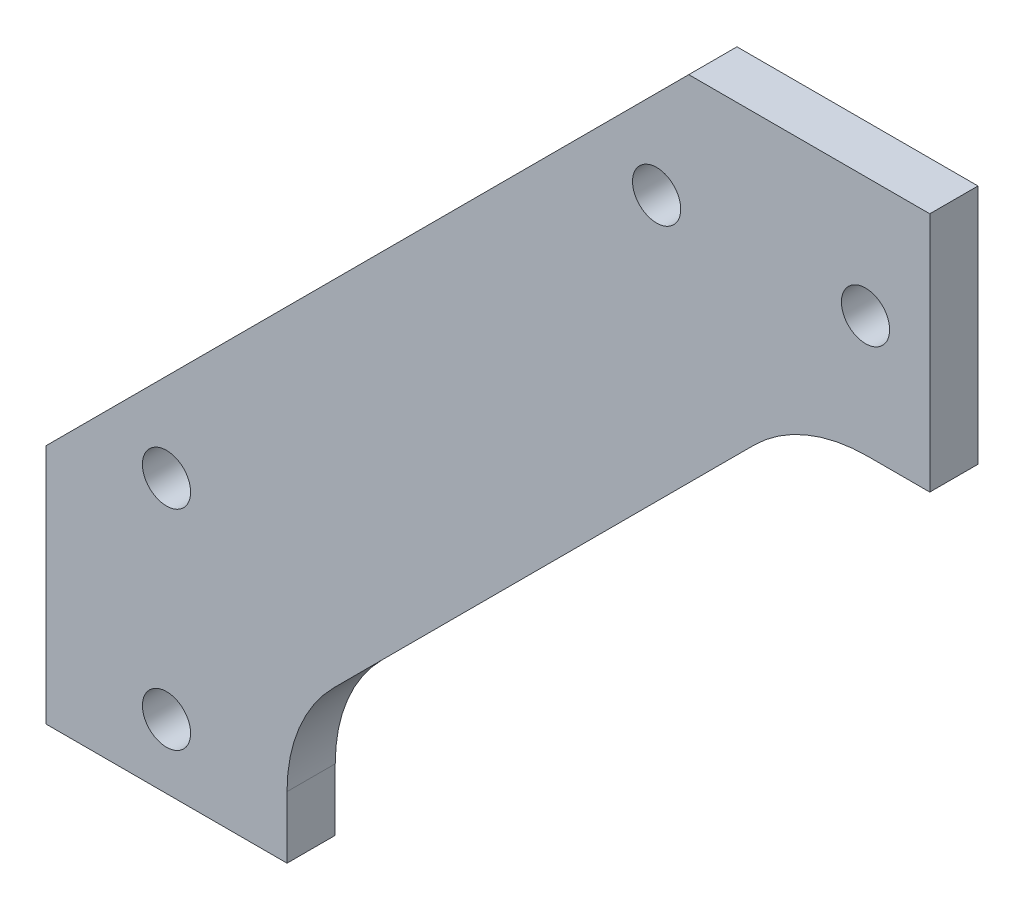
ISO-10303-21;
HEADER;
FILE_DESCRIPTION(('STEP AP214'),'2;1');
FILE_NAME('part.step','',(''),(''),'','','');
FILE_SCHEMA(('AUTOMOTIVE_DESIGN { 1 0 10303 214 1 1 1 1 }'));
ENDSEC;
DATA;
#1=APPLICATION_CONTEXT('core data for automotive mechanical design processes');
#2=APPLICATION_PROTOCOL_DEFINITION('international standard','automotive_design',2000,#1);
#3=PRODUCT_CONTEXT('',#1,'mechanical');
#4=PRODUCT('Part','Part','',(#3));
#5=PRODUCT_RELATED_PRODUCT_CATEGORY('part','',(#4));
#6=PRODUCT_DEFINITION_FORMATION('','',#4);
#7=PRODUCT_DEFINITION_CONTEXT('part definition',#1,'design');
#8=PRODUCT_DEFINITION('design','',#6,#7);
#9=PRODUCT_DEFINITION_SHAPE('','',#8);
#10=(LENGTH_UNIT() NAMED_UNIT(*) SI_UNIT(.MILLI.,.METRE.));
#11=(NAMED_UNIT(*) PLANE_ANGLE_UNIT() SI_UNIT($,.RADIAN.));
#12=(NAMED_UNIT(*) SI_UNIT($,.STERADIAN.) SOLID_ANGLE_UNIT());
#13=UNCERTAINTY_MEASURE_WITH_UNIT(LENGTH_MEASURE(1.E-05),#10,'distance_accuracy_value','');
#14=(GEOMETRIC_REPRESENTATION_CONTEXT(3) GLOBAL_UNCERTAINTY_ASSIGNED_CONTEXT((#13)) GLOBAL_UNIT_ASSIGNED_CONTEXT((#10,
#11,#12)) REPRESENTATION_CONTEXT('',''));
#15=CARTESIAN_POINT('',(0.,0.,0.));
#16=DIRECTION('',(0.,0.,1.));
#17=DIRECTION('',(1.,0.,0.));
#18=AXIS2_PLACEMENT_3D('',#15,#16,#17);
#19=CARTESIAN_POINT('',(-39.9999999999999,-40.,3.));
#20=DIRECTION('',(0.707106781186549,-0.707106781186546,0.));
#21=DIRECTION('',(0.707106781186546,0.707106781186549,0.));
#22=AXIS2_PLACEMENT_3D('',#19,#20,#21);
#23=PLANE('',#22);
#24=DIRECTION('',(-0.707106781186546,-0.707106781186549,0.));
#25=VECTOR('',#24,1.);
#26=CARTESIAN_POINT('',(-39.9999999999999,-40.,0.));
#27=LINE('',#26,#25);
#28=CARTESIAN_POINT('',(0.,0.,0.));
#29=VERTEX_POINT('',#28);
#30=CARTESIAN_POINT('',(-39.9999999999999,-40.,0.));
#31=VERTEX_POINT('',#30);
#32=EDGE_CURVE('E147',#29,#31,#27,.T.);
#33=ORIENTED_EDGE('',*,*,#32,.T.);
#34=DIRECTION('',(0.,0.,-1.));
#35=VECTOR('',#34,1.);
#36=CARTESIAN_POINT('',(-39.9999999999999,-40.,3.));
#37=LINE('',#36,#35);
#38=CARTESIAN_POINT('',(-39.9999999999999,-40.,3.));
#39=VERTEX_POINT('',#38);
#40=EDGE_CURVE('E11',#39,#31,#37,.T.);
#41=ORIENTED_EDGE('',*,*,#40,.F.);
#42=DIRECTION('',(-0.707106781186546,-0.707106781186549,0.));
#43=VECTOR('',#42,1.);
#44=CARTESIAN_POINT('',(-39.9999999999999,-40.,3.));
#45=LINE('',#44,#43);
#46=CARTESIAN_POINT('',(0.,0.,3.));
#47=VERTEX_POINT('',#46);
#48=EDGE_CURVE('E166',#47,#39,#45,.T.);
#49=ORIENTED_EDGE('',*,*,#48,.F.);
#50=DIRECTION('',(0.,0.,-1.));
#51=VECTOR('',#50,1.);
#52=CARTESIAN_POINT('',(0.,0.,3.));
#53=LINE('',#52,#51);
#54=EDGE_CURVE('E143',#47,#29,#53,.T.);
#55=ORIENTED_EDGE('',*,*,#54,.T.);
#56=EDGE_LOOP('',(#33,#41,#49,#55));
#57=FACE_BOUND('',#56,.T.);
#58=ADVANCED_FACE('F39',(#57),#23,.F.);
#59=CARTESIAN_POINT('',(-39.9999999999999,-55.,3.));
#60=DIRECTION('',(1.,0.,0.));
#61=DIRECTION('',(0.,1.,0.));
#62=AXIS2_PLACEMENT_3D('',#59,#60,#61);
#63=PLANE('',#62);
#64=DIRECTION('',(0.,-1.,0.));
#65=VECTOR('',#64,1.);
#66=CARTESIAN_POINT('',(-39.9999999999999,-55.,0.));
#67=LINE('',#66,#65);
#68=CARTESIAN_POINT('',(-39.9999999999999,-55.,0.));
#69=VERTEX_POINT('',#68);
#70=EDGE_CURVE('E150',#31,#69,#67,.T.);
#71=ORIENTED_EDGE('',*,*,#70,.T.);
#72=DIRECTION('',(0.,0.,-1.));
#73=VECTOR('',#72,1.);
#74=CARTESIAN_POINT('',(-39.9999999999999,-55.,3.));
#75=LINE('',#74,#73);
#76=CARTESIAN_POINT('',(-39.9999999999999,-55.,3.));
#77=VERTEX_POINT('',#76);
#78=EDGE_CURVE('E47',#77,#69,#75,.T.);
#79=ORIENTED_EDGE('',*,*,#78,.F.);
#80=DIRECTION('',(0.,-1.,0.));
#81=VECTOR('',#80,1.);
#82=CARTESIAN_POINT('',(-39.9999999999999,-55.,3.));
#83=LINE('',#82,#81);
#84=EDGE_CURVE('E104',#39,#77,#83,.T.);
#85=ORIENTED_EDGE('',*,*,#84,.F.);
#86=ORIENTED_EDGE('',*,*,#40,.T.);
#87=EDGE_LOOP('',(#71,#79,#85,#86));
#88=FACE_BOUND('',#87,.T.);
#89=ADVANCED_FACE('F271',(#88),#63,.F.);
#90=CARTESIAN_POINT('',(-24.9999999999999,-55.,3.));
#91=DIRECTION('',(0.,1.,0.));
#92=DIRECTION('',(-1.,0.,0.));
#93=AXIS2_PLACEMENT_3D('',#90,#91,#92);
#94=PLANE('',#93);
#95=DIRECTION('',(1.,0.,0.));
#96=VECTOR('',#95,1.);
#97=CARTESIAN_POINT('',(-24.9999999999999,-55.,0.));
#98=LINE('',#97,#96);
#99=CARTESIAN_POINT('',(-24.9999999999999,-55.,0.));
#100=VERTEX_POINT('',#99);
#101=EDGE_CURVE('E153',#69,#100,#98,.T.);
#102=ORIENTED_EDGE('',*,*,#101,.T.);
#103=DIRECTION('',(0.,0.,-1.));
#104=VECTOR('',#103,1.);
#105=CARTESIAN_POINT('',(-24.9999999999999,-55.,3.));
#106=LINE('',#105,#104);
#107=CARTESIAN_POINT('',(-24.9999999999999,-55.,3.));
#108=VERTEX_POINT('',#107);
#109=EDGE_CURVE('E179',#108,#100,#106,.T.);
#110=ORIENTED_EDGE('',*,*,#109,.F.);
#111=DIRECTION('',(1.,0.,0.));
#112=VECTOR('',#111,1.);
#113=CARTESIAN_POINT('',(-24.9999999999999,-55.,3.));
#114=LINE('',#113,#112);
#115=EDGE_CURVE('E187',#77,#108,#114,.T.);
#116=ORIENTED_EDGE('',*,*,#115,.F.);
#117=ORIENTED_EDGE('',*,*,#78,.T.);
#118=EDGE_LOOP('',(#102,#110,#116,#117));
#119=FACE_BOUND('',#118,.T.);
#120=ADVANCED_FACE('F185',(#119),#94,.F.);
#121=CARTESIAN_POINT('',(-24.9999999999999,-51.142135623731,3.));
#122=DIRECTION('',(-1.,0.,0.));
#123=DIRECTION('',(0.,0.,1.));
#124=AXIS2_PLACEMENT_3D('',#121,#122,#123);
#125=PLANE('',#124);
#126=DIRECTION('',(0.,1.,0.));
#127=VECTOR('',#126,1.);
#128=CARTESIAN_POINT('',(-24.9999999999999,-51.142135623731,0.));
#129=LINE('',#128,#127);
#130=CARTESIAN_POINT('',(-24.9999999999999,-51.142135623731,0.));
#131=VERTEX_POINT('',#130);
#132=EDGE_CURVE('E155',#100,#131,#129,.T.);
#133=ORIENTED_EDGE('',*,*,#132,.T.);
#134=DIRECTION('',(0.,0.,-1.));
#135=VECTOR('',#134,1.);
#136=CARTESIAN_POINT('',(-24.9999999999999,-51.142135623731,3.));
#137=LINE('',#136,#135);
#138=CARTESIAN_POINT('',(-24.9999999999999,-51.142135623731,3.));
#139=VERTEX_POINT('',#138);
#140=EDGE_CURVE('E176',#139,#131,#137,.T.);
#141=ORIENTED_EDGE('',*,*,#140,.F.);
#142=DIRECTION('',(0.,1.,0.));
#143=VECTOR('',#142,1.);
#144=CARTESIAN_POINT('',(-24.9999999999999,-51.142135623731,3.));
#145=LINE('',#144,#143);
#146=EDGE_CURVE('E205',#108,#139,#145,.T.);
#147=ORIENTED_EDGE('',*,*,#146,.F.);
#148=ORIENTED_EDGE('',*,*,#109,.T.);
#149=EDGE_LOOP('',(#133,#141,#147,#148));
#150=FACE_BOUND('',#149,.T.);
#151=ADVANCED_FACE('F196',(#150),#125,.F.);
#152=CARTESIAN_POINT('',(-14.9999999999999,-51.1421356237309,3.));
#153=DIRECTION('',(0.,0.,-1.));
#154=DIRECTION('',(-1.,0.,0.));
#155=AXIS2_PLACEMENT_3D('',#152,#153,#154);
#156=CYLINDRICAL_SURFACE('',#155,10.);
#157=CARTESIAN_POINT('',(-14.9999999999999,-51.1421356237309,0.));
#158=DIRECTION('',(0.,0.,-1.));
#159=DIRECTION('',(1.,0.,0.));
#160=AXIS2_PLACEMENT_3D('',#157,#158,#159);
#161=CIRCLE('',#160,10.);
#162=CARTESIAN_POINT('',(-22.0710678118653,-44.0710678118654,0.));
#163=VERTEX_POINT('',#162);
#164=EDGE_CURVE('E157',#131,#163,#161,.T.);
#165=ORIENTED_EDGE('',*,*,#164,.T.);
#166=DIRECTION('',(0.,0.,-1.));
#167=VECTOR('',#166,1.);
#168=CARTESIAN_POINT('',(-22.0710678118653,-44.0710678118654,3.));
#169=LINE('',#168,#167);
#170=CARTESIAN_POINT('',(-22.0710678118653,-44.0710678118654,3.));
#171=VERTEX_POINT('',#170);
#172=EDGE_CURVE('E173',#171,#163,#169,.T.);
#173=ORIENTED_EDGE('',*,*,#172,.F.);
#174=CARTESIAN_POINT('',(-14.9999999999999,-51.1421356237309,3.));
#175=DIRECTION('',(0.,0.,-1.));
#176=DIRECTION('',(1.,0.,0.));
#177=AXIS2_PLACEMENT_3D('',#174,#175,#176);
#178=CIRCLE('',#177,10.);
#179=EDGE_CURVE('E202',#139,#171,#178,.T.);
#180=ORIENTED_EDGE('',*,*,#179,.F.);
#181=ORIENTED_EDGE('',*,*,#140,.T.);
#182=EDGE_LOOP('',(#165,#173,#180,#181));
#183=FACE_BOUND('',#182,.T.);
#184=ADVANCED_FACE('F200',(#183),#156,.F.);
#185=CARTESIAN_POINT('',(4.07106781186545,-17.9289321881346,3.));
#186=DIRECTION('',(-0.707106781186549,0.707106781186546,0.));
#187=DIRECTION('',(-0.707106781186546,-0.707106781186549,0.));
#188=AXIS2_PLACEMENT_3D('',#185,#186,#187);
#189=PLANE('',#188);
#190=DIRECTION('',(0.707106781186546,0.707106781186549,0.));
#191=VECTOR('',#190,1.);
#192=CARTESIAN_POINT('',(4.07106781186545,-17.9289321881346,0.));
#193=LINE('',#192,#191);
#194=CARTESIAN_POINT('',(4.07106781186545,-17.9289321881346,0.));
#195=VERTEX_POINT('',#194);
#196=EDGE_CURVE('E159',#163,#195,#193,.T.);
#197=ORIENTED_EDGE('',*,*,#196,.T.);
#198=DIRECTION('',(0.,0.,-1.));
#199=VECTOR('',#198,1.);
#200=CARTESIAN_POINT('',(4.07106781186545,-17.9289321881346,3.));
#201=LINE('',#200,#199);
#202=CARTESIAN_POINT('',(4.07106781186545,-17.9289321881346,3.));
#203=VERTEX_POINT('',#202);
#204=EDGE_CURVE('E170',#203,#195,#201,.T.);
#205=ORIENTED_EDGE('',*,*,#204,.F.);
#206=DIRECTION('',(0.707106781186546,0.707106781186549,0.));
#207=VECTOR('',#206,1.);
#208=CARTESIAN_POINT('',(4.07106781186545,-17.9289321881346,3.));
#209=LINE('',#208,#207);
#210=EDGE_CURVE('E204',#171,#203,#209,.T.);
#211=ORIENTED_EDGE('',*,*,#210,.F.);
#212=ORIENTED_EDGE('',*,*,#172,.T.);
#213=EDGE_LOOP('',(#197,#205,#211,#212));
#214=FACE_BOUND('',#213,.T.);
#215=ADVANCED_FACE('F283',(#214),#189,.F.);
#216=CARTESIAN_POINT('',(11.142135623731,-25.,3.));
#217=DIRECTION('',(0.,0.,-1.));
#218=DIRECTION('',(-1.,0.,0.));
#219=AXIS2_PLACEMENT_3D('',#216,#217,#218);
#220=CYLINDRICAL_SURFACE('',#219,10.);
#221=CARTESIAN_POINT('',(11.142135623731,-25.,0.));
#222=DIRECTION('',(0.,0.,-1.));
#223=DIRECTION('',(1.,0.,0.));
#224=AXIS2_PLACEMENT_3D('',#221,#222,#223);
#225=CIRCLE('',#224,10.);
#226=CARTESIAN_POINT('',(11.142135623731,-15.,0.));
#227=VERTEX_POINT('',#226);
#228=EDGE_CURVE('E161',#195,#227,#225,.T.);
#229=ORIENTED_EDGE('',*,*,#228,.T.);
#230=DIRECTION('',(0.,0.,-1.));
#231=VECTOR('',#230,1.);
#232=CARTESIAN_POINT('',(11.142135623731,-15.,3.));
#233=LINE('',#232,#231);
#234=CARTESIAN_POINT('',(11.142135623731,-15.,3.));
#235=VERTEX_POINT('',#234);
#236=EDGE_CURVE('E138',#235,#227,#233,.T.);
#237=ORIENTED_EDGE('',*,*,#236,.F.);
#238=CARTESIAN_POINT('',(11.142135623731,-25.,3.));
#239=DIRECTION('',(0.,0.,-1.));
#240=DIRECTION('',(1.,0.,0.));
#241=AXIS2_PLACEMENT_3D('',#238,#239,#240);
#242=CIRCLE('',#241,10.);
#243=EDGE_CURVE('E129',#203,#235,#242,.T.);
#244=ORIENTED_EDGE('',*,*,#243,.F.);
#245=ORIENTED_EDGE('',*,*,#204,.T.);
#246=EDGE_LOOP('',(#229,#237,#244,#245));
#247=FACE_BOUND('',#246,.T.);
#248=ADVANCED_FACE('F280',(#247),#220,.F.);
#249=CARTESIAN_POINT('',(15.,-15.,3.));
#250=DIRECTION('',(0.,1.,0.));
#251=DIRECTION('',(0.,0.,1.));
#252=AXIS2_PLACEMENT_3D('',#249,#250,#251);
#253=PLANE('',#252);
#254=DIRECTION('',(1.,0.,0.));
#255=VECTOR('',#254,1.);
#256=CARTESIAN_POINT('',(15.,-15.,0.));
#257=LINE('',#256,#255);
#258=CARTESIAN_POINT('',(15.,-15.,0.));
#259=VERTEX_POINT('',#258);
#260=EDGE_CURVE('E137',#227,#259,#257,.T.);
#261=ORIENTED_EDGE('',*,*,#260,.T.);
#262=DIRECTION('',(0.,0.,-1.));
#263=VECTOR('',#262,1.);
#264=CARTESIAN_POINT('',(15.,-15.,3.));
#265=LINE('',#264,#263);
#266=CARTESIAN_POINT('',(15.,-15.,3.));
#267=VERTEX_POINT('',#266);
#268=EDGE_CURVE('E134',#267,#259,#265,.T.);
#269=ORIENTED_EDGE('',*,*,#268,.F.);
#270=DIRECTION('',(1.,0.,0.));
#271=VECTOR('',#270,1.);
#272=CARTESIAN_POINT('',(15.,-15.,3.));
#273=LINE('',#272,#271);
#274=EDGE_CURVE('E123',#235,#267,#273,.T.);
#275=ORIENTED_EDGE('',*,*,#274,.F.);
#276=ORIENTED_EDGE('',*,*,#236,.T.);
#277=EDGE_LOOP('',(#261,#269,#275,#276));
#278=FACE_BOUND('',#277,.T.);
#279=ADVANCED_FACE('F135',(#278),#253,.F.);
#280=CARTESIAN_POINT('',(15.,0.,3.));
#281=DIRECTION('',(-1.,0.,0.));
#282=DIRECTION('',(0.,-1.,0.));
#283=AXIS2_PLACEMENT_3D('',#280,#281,#282);
#284=PLANE('',#283);
#285=DIRECTION('',(0.,1.,0.));
#286=VECTOR('',#285,1.);
#287=CARTESIAN_POINT('',(15.,0.,0.));
#288=LINE('',#287,#286);
#289=CARTESIAN_POINT('',(15.,0.,0.));
#290=VERTEX_POINT('',#289);
#291=EDGE_CURVE('E90',#259,#290,#288,.T.);
#292=ORIENTED_EDGE('',*,*,#291,.T.);
#293=DIRECTION('',(0.,0.,-1.));
#294=VECTOR('',#293,1.);
#295=CARTESIAN_POINT('',(15.,0.,3.));
#296=LINE('',#295,#294);
#297=CARTESIAN_POINT('',(15.,0.,3.));
#298=VERTEX_POINT('',#297);
#299=EDGE_CURVE('E139',#298,#290,#296,.T.);
#300=ORIENTED_EDGE('',*,*,#299,.F.);
#301=DIRECTION('',(0.,1.,0.));
#302=VECTOR('',#301,1.);
#303=CARTESIAN_POINT('',(15.,0.,3.));
#304=LINE('',#303,#302);
#305=EDGE_CURVE('E127',#267,#298,#304,.T.);
#306=ORIENTED_EDGE('',*,*,#305,.F.);
#307=ORIENTED_EDGE('',*,*,#268,.T.);
#308=EDGE_LOOP('',(#292,#300,#306,#307));
#309=FACE_BOUND('',#308,.T.);
#310=ADVANCED_FACE('F141',(#309),#284,.F.);
#311=CARTESIAN_POINT('',(0.,0.,3.));
#312=DIRECTION('',(0.,-1.,0.));
#313=DIRECTION('',(0.,0.,-1.));
#314=AXIS2_PLACEMENT_3D('',#311,#312,#313);
#315=PLANE('',#314);
#316=DIRECTION('',(-1.,0.,0.));
#317=VECTOR('',#316,1.);
#318=CARTESIAN_POINT('',(0.,0.,0.));
#319=LINE('',#318,#317);
#320=EDGE_CURVE('E96',#290,#29,#319,.T.);
#321=ORIENTED_EDGE('',*,*,#320,.T.);
#322=ORIENTED_EDGE('',*,*,#54,.F.);
#323=DIRECTION('',(-1.,0.,0.));
#324=VECTOR('',#323,1.);
#325=CARTESIAN_POINT('',(0.,0.,3.));
#326=LINE('',#325,#324);
#327=EDGE_CURVE('E55',#298,#47,#326,.T.);
#328=ORIENTED_EDGE('',*,*,#327,.F.);
#329=ORIENTED_EDGE('',*,*,#299,.T.);
#330=EDGE_LOOP('',(#321,#322,#328,#329));
#331=FACE_BOUND('',#330,.T.);
#332=ADVANCED_FACE('F248',(#331),#315,.F.);
#333=CARTESIAN_POINT('',(11.142135623731,-25.,3.));
#334=DIRECTION('',(0.,0.,1.));
#335=DIRECTION('',(1.,0.,0.));
#336=AXIS2_PLACEMENT_3D('',#333,#334,#335);
#337=PLANE('',#336);
#338=CARTESIAN_POINT('',(11.,-7.5,3.));
#339=DIRECTION('',(0.,0.,1.));
#340=DIRECTION('',(1.,0.,0.));
#341=AXIS2_PLACEMENT_3D('',#338,#339,#340);
#342=CIRCLE('',#341,1.5);
#343=CARTESIAN_POINT('',(12.5,-7.5,3.));
#344=VERTEX_POINT('',#343);
#345=EDGE_CURVE('E226',#344,#344,#342,.T.);
#346=ORIENTED_EDGE('',*,*,#345,.F.);
#347=EDGE_LOOP('',(#346));
#348=FACE_BOUND('',#347,.T.);
#349=CARTESIAN_POINT('',(-32.4999999999999,-38.,3.));
#350=DIRECTION('',(0.,0.,1.));
#351=DIRECTION('',(1.,0.,0.));
#352=AXIS2_PLACEMENT_3D('',#349,#350,#351);
#353=CIRCLE('',#352,1.5);
#354=CARTESIAN_POINT('',(-30.9999999999999,-38.,3.));
#355=VERTEX_POINT('',#354);
#356=EDGE_CURVE('E227',#355,#355,#353,.T.);
#357=ORIENTED_EDGE('',*,*,#356,.F.);
#358=EDGE_LOOP('',(#357));
#359=FACE_BOUND('',#358,.T.);
#360=CARTESIAN_POINT('',(-32.4999999999999,-51.,3.));
#361=DIRECTION('',(0.,0.,1.));
#362=DIRECTION('',(1.,0.,0.));
#363=AXIS2_PLACEMENT_3D('',#360,#361,#362);
#364=CIRCLE('',#363,1.5);
#365=CARTESIAN_POINT('',(-30.9999999999999,-51.,3.));
#366=VERTEX_POINT('',#365);
#367=EDGE_CURVE('E213',#366,#366,#364,.T.);
#368=ORIENTED_EDGE('',*,*,#367,.F.);
#369=EDGE_LOOP('',(#368));
#370=FACE_BOUND('',#369,.T.);
#371=CARTESIAN_POINT('',(-2.,-7.5,3.));
#372=DIRECTION('',(0.,0.,1.));
#373=DIRECTION('',(1.,0.,0.));
#374=AXIS2_PLACEMENT_3D('',#371,#372,#373);
#375=CIRCLE('',#374,1.5);
#376=CARTESIAN_POINT('',(-0.499999999999998,-7.5,3.));
#377=VERTEX_POINT('',#376);
#378=EDGE_CURVE('E220',#377,#377,#375,.T.);
#379=ORIENTED_EDGE('',*,*,#378,.F.);
#380=EDGE_LOOP('',(#379));
#381=FACE_BOUND('',#380,.T.);
#382=ORIENTED_EDGE('',*,*,#48,.T.);
#383=ORIENTED_EDGE('',*,*,#84,.T.);
#384=ORIENTED_EDGE('',*,*,#115,.T.);
#385=ORIENTED_EDGE('',*,*,#146,.T.);
#386=ORIENTED_EDGE('',*,*,#179,.T.);
#387=ORIENTED_EDGE('',*,*,#210,.T.);
#388=ORIENTED_EDGE('',*,*,#243,.T.);
#389=ORIENTED_EDGE('',*,*,#274,.T.);
#390=ORIENTED_EDGE('',*,*,#305,.T.);
#391=ORIENTED_EDGE('',*,*,#327,.T.);
#392=EDGE_LOOP('',(#382,#383,#384,#385,#386,#387,#388,#389,#390,#391));
#393=FACE_BOUND('',#392,.T.);
#394=ADVANCED_FACE('F125',(#348,#359,#370,#381,#393),#337,.T.);
#395=CARTESIAN_POINT('',(11.142135623731,-25.,0.));
#396=DIRECTION('',(0.,0.,1.));
#397=DIRECTION('',(1.,0.,0.));
#398=AXIS2_PLACEMENT_3D('',#395,#396,#397);
#399=PLANE('',#398);
#400=CARTESIAN_POINT('',(11.,-7.5,0.));
#401=DIRECTION('',(0.,0.,1.));
#402=DIRECTION('',(1.,0.,0.));
#403=AXIS2_PLACEMENT_3D('',#400,#401,#402);
#404=CIRCLE('',#403,1.5);
#405=CARTESIAN_POINT('',(12.5,-7.5,0.));
#406=VERTEX_POINT('',#405);
#407=EDGE_CURVE('E151',#406,#406,#404,.T.);
#408=ORIENTED_EDGE('',*,*,#407,.T.);
#409=EDGE_LOOP('',(#408));
#410=FACE_BOUND('',#409,.T.);
#411=CARTESIAN_POINT('',(-32.4999999999999,-38.,0.));
#412=DIRECTION('',(0.,0.,1.));
#413=DIRECTION('',(1.,0.,0.));
#414=AXIS2_PLACEMENT_3D('',#411,#412,#413);
#415=CIRCLE('',#414,1.5);
#416=CARTESIAN_POINT('',(-30.9999999999999,-38.,0.));
#417=VERTEX_POINT('',#416);
#418=EDGE_CURVE('E217',#417,#417,#415,.T.);
#419=ORIENTED_EDGE('',*,*,#418,.T.);
#420=EDGE_LOOP('',(#419));
#421=FACE_BOUND('',#420,.T.);
#422=CARTESIAN_POINT('',(-32.4999999999999,-51.,0.));
#423=DIRECTION('',(0.,0.,1.));
#424=DIRECTION('',(1.,0.,0.));
#425=AXIS2_PLACEMENT_3D('',#422,#423,#424);
#426=CIRCLE('',#425,1.5);
#427=CARTESIAN_POINT('',(-30.9999999999999,-51.,0.));
#428=VERTEX_POINT('',#427);
#429=EDGE_CURVE('E216',#428,#428,#426,.T.);
#430=ORIENTED_EDGE('',*,*,#429,.T.);
#431=EDGE_LOOP('',(#430));
#432=FACE_BOUND('',#431,.T.);
#433=CARTESIAN_POINT('',(-2.,-7.5,0.));
#434=DIRECTION('',(0.,0.,1.));
#435=DIRECTION('',(1.,0.,0.));
#436=AXIS2_PLACEMENT_3D('',#433,#434,#435);
#437=CIRCLE('',#436,1.5);
#438=CARTESIAN_POINT('',(-0.499999999999998,-7.5,0.));
#439=VERTEX_POINT('',#438);
#440=EDGE_CURVE('E223',#439,#439,#437,.T.);
#441=ORIENTED_EDGE('',*,*,#440,.T.);
#442=EDGE_LOOP('',(#441));
#443=FACE_BOUND('',#442,.T.);
#444=ORIENTED_EDGE('',*,*,#32,.F.);
#445=ORIENTED_EDGE('',*,*,#320,.F.);
#446=ORIENTED_EDGE('',*,*,#291,.F.);
#447=ORIENTED_EDGE('',*,*,#260,.F.);
#448=ORIENTED_EDGE('',*,*,#228,.F.);
#449=ORIENTED_EDGE('',*,*,#196,.F.);
#450=ORIENTED_EDGE('',*,*,#164,.F.);
#451=ORIENTED_EDGE('',*,*,#132,.F.);
#452=ORIENTED_EDGE('',*,*,#101,.F.);
#453=ORIENTED_EDGE('',*,*,#70,.F.);
#454=EDGE_LOOP('',(#444,#445,#446,#447,#448,#449,#450,#451,#452,#453));
#455=FACE_BOUND('',#454,.T.);
#456=ADVANCED_FACE('F191',(#410,#421,#432,#443,#455),#399,.F.);
#457=CARTESIAN_POINT('',(-2.,-7.5,0.));
#458=DIRECTION('',(0.,0.,1.));
#459=DIRECTION('',(1.,0.,0.));
#460=AXIS2_PLACEMENT_3D('',#457,#458,#459);
#461=CYLINDRICAL_SURFACE('',#460,1.5);
#462=ORIENTED_EDGE('',*,*,#440,.F.);
#463=EDGE_LOOP('',(#462));
#464=FACE_BOUND('',#463,.T.);
#465=ORIENTED_EDGE('',*,*,#378,.T.);
#466=EDGE_LOOP('',(#465));
#467=FACE_BOUND('',#466,.T.);
#468=ADVANCED_FACE('F256',(#464,#467),#461,.F.);
#469=CARTESIAN_POINT('',(-32.4999999999999,-51.,0.));
#470=DIRECTION('',(0.,0.,1.));
#471=DIRECTION('',(1.,0.,0.));
#472=AXIS2_PLACEMENT_3D('',#469,#470,#471);
#473=CYLINDRICAL_SURFACE('',#472,1.5);
#474=ORIENTED_EDGE('',*,*,#429,.F.);
#475=EDGE_LOOP('',(#474));
#476=FACE_BOUND('',#475,.T.);
#477=ORIENTED_EDGE('',*,*,#367,.T.);
#478=EDGE_LOOP('',(#477));
#479=FACE_BOUND('',#478,.T.);
#480=ADVANCED_FACE('F258',(#476,#479),#473,.F.);
#481=CARTESIAN_POINT('',(-32.4999999999999,-38.,0.));
#482=DIRECTION('',(0.,0.,1.));
#483=DIRECTION('',(1.,0.,0.));
#484=AXIS2_PLACEMENT_3D('',#481,#482,#483);
#485=CYLINDRICAL_SURFACE('',#484,1.5);
#486=ORIENTED_EDGE('',*,*,#418,.F.);
#487=EDGE_LOOP('',(#486));
#488=FACE_BOUND('',#487,.T.);
#489=ORIENTED_EDGE('',*,*,#356,.T.);
#490=EDGE_LOOP('',(#489));
#491=FACE_BOUND('',#490,.T.);
#492=ADVANCED_FACE('F242',(#488,#491),#485,.F.);
#493=CARTESIAN_POINT('',(11.,-7.5,0.));
#494=DIRECTION('',(0.,0.,1.));
#495=DIRECTION('',(1.,0.,0.));
#496=AXIS2_PLACEMENT_3D('',#493,#494,#495);
#497=CYLINDRICAL_SURFACE('',#496,1.5);
#498=ORIENTED_EDGE('',*,*,#407,.F.);
#499=EDGE_LOOP('',(#498));
#500=FACE_BOUND('',#499,.T.);
#501=ORIENTED_EDGE('',*,*,#345,.T.);
#502=EDGE_LOOP('',(#501));
#503=FACE_BOUND('',#502,.T.);
#504=ADVANCED_FACE('F239',(#500,#503),#497,.F.);
#505=CLOSED_SHELL('',(#58,#89,#120,#151,#184,#215,#248,#279,#310,#332,#394,#456,#468,#480,#492,#504));
#506=MANIFOLD_SOLID_BREP('B2',#505);
#507=ADVANCED_BREP_SHAPE_REPRESENTATION('',(#18,#506),#14);
#508=SHAPE_DEFINITION_REPRESENTATION(#9,#507);
ENDSEC;
END-ISO-10303-21;
